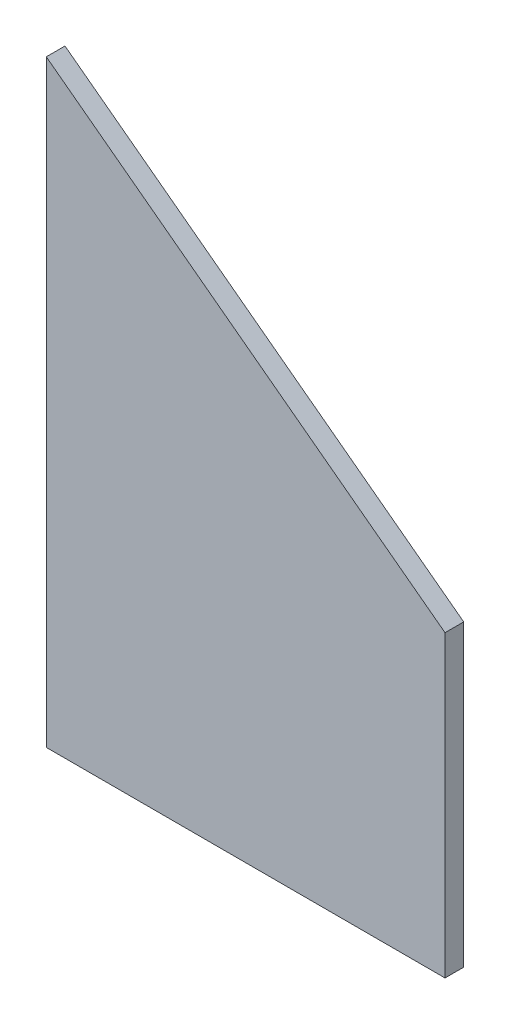
ISO-10303-21;
HEADER;
FILE_DESCRIPTION(('STEP AP214'),'2;1');
FILE_NAME('part.step','',(''),(''),'','','');
FILE_SCHEMA(('AUTOMOTIVE_DESIGN { 1 0 10303 214 1 1 1 1 }'));
ENDSEC;
DATA;
#1=APPLICATION_CONTEXT('core data for automotive mechanical design processes');
#2=APPLICATION_PROTOCOL_DEFINITION('international standard','automotive_design',2000,#1);
#3=PRODUCT_CONTEXT('',#1,'mechanical');
#4=PRODUCT('Part','Part','',(#3));
#5=PRODUCT_RELATED_PRODUCT_CATEGORY('part','',(#4));
#6=PRODUCT_DEFINITION_FORMATION('','',#4);
#7=PRODUCT_DEFINITION_CONTEXT('part definition',#1,'design');
#8=PRODUCT_DEFINITION('design','',#6,#7);
#9=PRODUCT_DEFINITION_SHAPE('','',#8);
#10=(LENGTH_UNIT() NAMED_UNIT(*) SI_UNIT(.MILLI.,.METRE.));
#11=(NAMED_UNIT(*) PLANE_ANGLE_UNIT() SI_UNIT($,.RADIAN.));
#12=(NAMED_UNIT(*) SI_UNIT($,.STERADIAN.) SOLID_ANGLE_UNIT());
#13=UNCERTAINTY_MEASURE_WITH_UNIT(LENGTH_MEASURE(1.E-05),#10,'distance_accuracy_value','');
#14=(GEOMETRIC_REPRESENTATION_CONTEXT(3) GLOBAL_UNCERTAINTY_ASSIGNED_CONTEXT((#13)) GLOBAL_UNIT_ASSIGNED_CONTEXT((#10,
#11,#12)) REPRESENTATION_CONTEXT('',''));
#15=CARTESIAN_POINT('',(0.,0.,0.));
#16=DIRECTION('',(0.,0.,1.));
#17=DIRECTION('',(1.,0.,0.));
#18=AXIS2_PLACEMENT_3D('',#15,#16,#17);
#19=CARTESIAN_POINT('',(-0.0625782963492635,-76.1999486083226,4.7625));
#20=DIRECTION('',(-0.00082123776183281,-0.999999662784212,0.));
#21=DIRECTION('',(0.999999662784212,-0.00082123776183281,0.));
#22=AXIS2_PLACEMENT_3D('',#19,#20,#21);
#23=PLANE('',#22);
#24=DIRECTION('',(-0.999999662784213,0.000821237761832811,0.));
#25=VECTOR('',#24,1.);
#26=CARTESIAN_POINT('',(-0.0625782963492635,-76.1999486083226,0.));
#27=LINE('',#26,#25);
#28=CARTESIAN_POINT('',(101.6,-76.2834377847388,0.));
#29=VERTEX_POINT('',#28);
#30=CARTESIAN_POINT('',(0.,-76.2,0.));
#31=VERTEX_POINT('',#30);
#32=EDGE_CURVE('E115',#29,#31,#27,.T.);
#33=ORIENTED_EDGE('',*,*,#32,.F.);
#34=DIRECTION('',(0.,0.,-1.));
#35=VECTOR('',#34,1.);
#36=CARTESIAN_POINT('',(101.6,-76.2834377847388,4.7625));
#37=LINE('',#36,#35);
#38=CARTESIAN_POINT('',(101.6,-76.2834377847388,4.7625));
#39=VERTEX_POINT('',#38);
#40=EDGE_CURVE('E11',#39,#29,#37,.T.);
#41=ORIENTED_EDGE('',*,*,#40,.F.);
#42=DIRECTION('',(-0.999999662784213,0.000821237761832811,0.));
#43=VECTOR('',#42,1.);
#44=CARTESIAN_POINT('',(-0.0625782963492635,-76.1999486083226,4.7625));
#45=LINE('',#44,#43);
#46=CARTESIAN_POINT('',(0.,-76.2,4.7625));
#47=VERTEX_POINT('',#46);
#48=EDGE_CURVE('E104',#39,#47,#45,.T.);
#49=ORIENTED_EDGE('',*,*,#48,.T.);
#50=DIRECTION('',(0.,0.,-1.));
#51=VECTOR('',#50,1.);
#52=CARTESIAN_POINT('',(0.,-76.2,4.7625));
#53=LINE('',#52,#51);
#54=EDGE_CURVE('E64',#47,#31,#53,.T.);
#55=ORIENTED_EDGE('',*,*,#54,.T.);
#56=EDGE_LOOP('',(#33,#41,#49,#55));
#57=FACE_BOUND('',#56,.T.);
#58=ADVANCED_FACE('F47',(#57),#23,.T.);
#59=CARTESIAN_POINT('',(101.6,0.,4.7625));
#60=DIRECTION('',(1.,0.,0.));
#61=DIRECTION('',(0.,1.,0.));
#62=AXIS2_PLACEMENT_3D('',#59,#60,#61);
#63=PLANE('',#62);
#64=DIRECTION('',(0.,-1.,0.));
#65=VECTOR('',#64,1.);
#66=CARTESIAN_POINT('',(101.6,0.,0.));
#67=LINE('',#66,#65);
#68=CARTESIAN_POINT('',(101.6,-0.0834377847387657,0.));
#69=VERTEX_POINT('',#68);
#70=EDGE_CURVE('E94',#69,#29,#67,.T.);
#71=ORIENTED_EDGE('',*,*,#70,.F.);
#72=DIRECTION('',(0.,0.,-1.));
#73=VECTOR('',#72,1.);
#74=CARTESIAN_POINT('',(101.6,-0.0834377847387657,4.7625));
#75=LINE('',#74,#73);
#76=CARTESIAN_POINT('',(101.6,-0.0834377847387657,4.7625));
#77=VERTEX_POINT('',#76);
#78=EDGE_CURVE('E56',#77,#69,#75,.T.);
#79=ORIENTED_EDGE('',*,*,#78,.F.);
#80=DIRECTION('',(0.,-1.,0.));
#81=VECTOR('',#80,1.);
#82=CARTESIAN_POINT('',(101.6,0.,4.7625));
#83=LINE('',#82,#81);
#84=EDGE_CURVE('E92',#77,#39,#83,.T.);
#85=ORIENTED_EDGE('',*,*,#84,.T.);
#86=ORIENTED_EDGE('',*,*,#40,.T.);
#87=EDGE_LOOP('',(#71,#79,#85,#86));
#88=FACE_BOUND('',#87,.T.);
#89=ADVANCED_FACE('F91',(#88),#63,.T.);
#90=CARTESIAN_POINT('',(36.5871894242916,48.7295611400945,4.7625));
#91=DIRECTION('',(0.600420225325885,0.79968465848709,0.));
#92=DIRECTION('',(-0.79968465848709,0.600420225325885,0.));
#93=AXIS2_PLACEMENT_3D('',#90,#91,#92);
#94=PLANE('',#93);
#95=DIRECTION('',(0.79968465848709,-0.600420225325885,0.));
#96=VECTOR('',#95,1.);
#97=CARTESIAN_POINT('',(36.5871894242916,48.7295611400945,0.));
#98=LINE('',#97,#96);
#99=CARTESIAN_POINT('',(0.,76.2,0.));
#100=VERTEX_POINT('',#99);
#101=EDGE_CURVE('E120',#100,#69,#98,.T.);
#102=ORIENTED_EDGE('',*,*,#101,.F.);
#103=DIRECTION('',(0.,0.,-1.));
#104=VECTOR('',#103,1.);
#105=CARTESIAN_POINT('',(0.,76.2,4.7625));
#106=LINE('',#105,#104);
#107=CARTESIAN_POINT('',(0.,76.2,4.7625));
#108=VERTEX_POINT('',#107);
#109=EDGE_CURVE('E77',#108,#100,#106,.T.);
#110=ORIENTED_EDGE('',*,*,#109,.F.);
#111=DIRECTION('',(0.79968465848709,-0.600420225325885,0.));
#112=VECTOR('',#111,1.);
#113=CARTESIAN_POINT('',(36.5871894242916,48.7295611400945,4.7625));
#114=LINE('',#113,#112);
#115=EDGE_CURVE('E103',#108,#77,#114,.T.);
#116=ORIENTED_EDGE('',*,*,#115,.T.);
#117=ORIENTED_EDGE('',*,*,#78,.T.);
#118=EDGE_LOOP('',(#102,#110,#116,#117));
#119=FACE_BOUND('',#118,.T.);
#120=ADVANCED_FACE('F107',(#119),#94,.T.);
#121=CARTESIAN_POINT('',(0.,0.,4.7625));
#122=DIRECTION('',(-1.,0.,0.));
#123=DIRECTION('',(0.,-1.,0.));
#124=AXIS2_PLACEMENT_3D('',#121,#122,#123);
#125=PLANE('',#124);
#126=DIRECTION('',(0.,1.,0.));
#127=VECTOR('',#126,1.);
#128=CARTESIAN_POINT('',(0.,0.,0.));
#129=LINE('',#128,#127);
#130=EDGE_CURVE('E123',#31,#100,#129,.T.);
#131=ORIENTED_EDGE('',*,*,#130,.F.);
#132=ORIENTED_EDGE('',*,*,#54,.F.);
#133=DIRECTION('',(0.,1.,0.));
#134=VECTOR('',#133,1.);
#135=CARTESIAN_POINT('',(0.,0.,4.7625));
#136=LINE('',#135,#134);
#137=EDGE_CURVE('E109',#47,#108,#136,.T.);
#138=ORIENTED_EDGE('',*,*,#137,.T.);
#139=ORIENTED_EDGE('',*,*,#109,.T.);
#140=EDGE_LOOP('',(#131,#132,#138,#139));
#141=FACE_BOUND('',#140,.T.);
#142=ADVANCED_FACE('F132',(#141),#125,.T.);
#143=CARTESIAN_POINT('',(0.,0.,4.7625));
#144=DIRECTION('',(0.,0.,1.));
#145=DIRECTION('',(1.,0.,0.));
#146=AXIS2_PLACEMENT_3D('',#143,#144,#145);
#147=PLANE('',#146);
#148=ORIENTED_EDGE('',*,*,#48,.F.);
#149=ORIENTED_EDGE('',*,*,#84,.F.);
#150=ORIENTED_EDGE('',*,*,#115,.F.);
#151=ORIENTED_EDGE('',*,*,#137,.F.);
#152=EDGE_LOOP('',(#148,#149,#150,#151));
#153=FACE_BOUND('',#152,.T.);
#154=ADVANCED_FACE('F101',(#153),#147,.T.);
#155=CARTESIAN_POINT('',(0.,0.,0.));
#156=DIRECTION('',(0.,0.,1.));
#157=DIRECTION('',(1.,0.,0.));
#158=AXIS2_PLACEMENT_3D('',#155,#156,#157);
#159=PLANE('',#158);
#160=ORIENTED_EDGE('',*,*,#32,.T.);
#161=ORIENTED_EDGE('',*,*,#130,.T.);
#162=ORIENTED_EDGE('',*,*,#101,.T.);
#163=ORIENTED_EDGE('',*,*,#70,.T.);
#164=EDGE_LOOP('',(#160,#161,#162,#163));
#165=FACE_BOUND('',#164,.T.);
#166=ADVANCED_FACE('F139',(#165),#159,.F.);
#167=CLOSED_SHELL('',(#58,#89,#120,#142,#154,#166));
#168=MANIFOLD_SOLID_BREP('B2',#167);
#169=ADVANCED_BREP_SHAPE_REPRESENTATION('',(#18,#168),#14);
#170=SHAPE_DEFINITION_REPRESENTATION(#9,#169);
ENDSEC;
END-ISO-10303-21;
